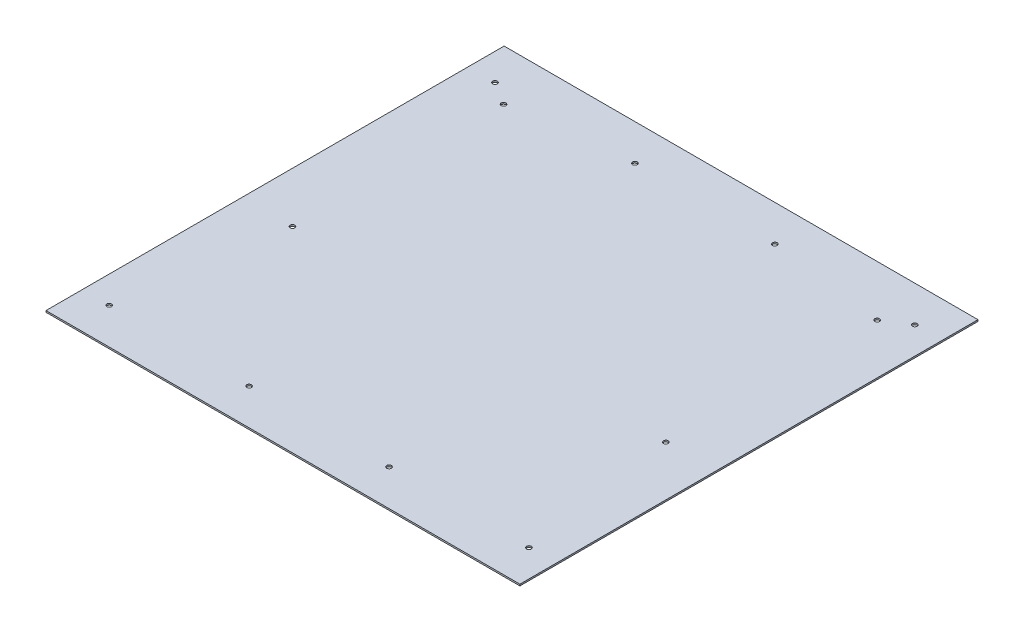
ISO-10303-21;
HEADER;
FILE_DESCRIPTION(('STEP AP214'),'2;1');
FILE_NAME('part.step','',(''),(''),'','','');
FILE_SCHEMA(('AUTOMOTIVE_DESIGN { 1 0 10303 214 1 1 1 1 }'));
ENDSEC;
DATA;
#1=APPLICATION_CONTEXT('core data for automotive mechanical design processes');
#2=APPLICATION_PROTOCOL_DEFINITION('international standard','automotive_design',2000,#1);
#3=PRODUCT_CONTEXT('',#1,'mechanical');
#4=PRODUCT('Part','Part','',(#3));
#5=PRODUCT_RELATED_PRODUCT_CATEGORY('part','',(#4));
#6=PRODUCT_DEFINITION_FORMATION('','',#4);
#7=PRODUCT_DEFINITION_CONTEXT('part definition',#1,'design');
#8=PRODUCT_DEFINITION('design','',#6,#7);
#9=PRODUCT_DEFINITION_SHAPE('','',#8);
#10=(LENGTH_UNIT() NAMED_UNIT(*) SI_UNIT(.MILLI.,.METRE.));
#11=(NAMED_UNIT(*) PLANE_ANGLE_UNIT() SI_UNIT($,.RADIAN.));
#12=(NAMED_UNIT(*) SI_UNIT($,.STERADIAN.) SOLID_ANGLE_UNIT());
#13=UNCERTAINTY_MEASURE_WITH_UNIT(LENGTH_MEASURE(1.E-05),#10,'distance_accuracy_value','');
#14=(GEOMETRIC_REPRESENTATION_CONTEXT(3) GLOBAL_UNCERTAINTY_ASSIGNED_CONTEXT((#13)) GLOBAL_UNIT_ASSIGNED_CONTEXT((#10,
#11,#12)) REPRESENTATION_CONTEXT('',''));
#15=CARTESIAN_POINT('',(0.,0.,0.));
#16=DIRECTION('',(0.,0.,1.));
#17=DIRECTION('',(1.,0.,0.));
#18=AXIS2_PLACEMENT_3D('',#15,#16,#17);
#19=CARTESIAN_POINT('',(0.,-1.,0.));
#20=DIRECTION('',(-1.,0.,0.));
#21=DIRECTION('',(0.,0.,1.));
#22=AXIS2_PLACEMENT_3D('',#19,#20,#21);
#23=PLANE('',#22);
#24=DIRECTION('',(0.,0.,1.));
#25=VECTOR('',#24,1.);
#26=CARTESIAN_POINT('',(0.,0.,0.));
#27=LINE('',#26,#25);
#28=CARTESIAN_POINT('',(0.,0.,0.));
#29=VERTEX_POINT('',#28);
#30=CARTESIAN_POINT('',(0.,0.,290.));
#31=VERTEX_POINT('',#30);
#32=EDGE_CURVE('E108',#29,#31,#27,.T.);
#33=ORIENTED_EDGE('',*,*,#32,.F.);
#34=DIRECTION('',(0.,1.,0.));
#35=VECTOR('',#34,1.);
#36=CARTESIAN_POINT('',(0.,-1.,0.));
#37=LINE('',#36,#35);
#38=CARTESIAN_POINT('',(0.,-1.,0.));
#39=VERTEX_POINT('',#38);
#40=EDGE_CURVE('E11',#39,#29,#37,.T.);
#41=ORIENTED_EDGE('',*,*,#40,.F.);
#42=DIRECTION('',(0.,0.,1.));
#43=VECTOR('',#42,1.);
#44=CARTESIAN_POINT('',(0.,-1.,0.));
#45=LINE('',#44,#43);
#46=CARTESIAN_POINT('',(0.,-1.,290.));
#47=VERTEX_POINT('',#46);
#48=EDGE_CURVE('E101',#39,#47,#45,.T.);
#49=ORIENTED_EDGE('',*,*,#48,.T.);
#50=DIRECTION('',(0.,1.,0.));
#51=VECTOR('',#50,1.);
#52=CARTESIAN_POINT('',(0.,-1.,290.));
#53=LINE('',#52,#51);
#54=EDGE_CURVE('E46',#47,#31,#53,.T.);
#55=ORIENTED_EDGE('',*,*,#54,.T.);
#56=EDGE_LOOP('',(#33,#41,#49,#55));
#57=FACE_BOUND('',#56,.T.);
#58=ADVANCED_FACE('F43',(#57),#23,.T.);
#59=CARTESIAN_POINT('',(0.,-1.,0.));
#60=DIRECTION('',(0.,0.,-1.));
#61=DIRECTION('',(-1.,0.,0.));
#62=AXIS2_PLACEMENT_3D('',#59,#60,#61);
#63=PLANE('',#62);
#64=DIRECTION('',(-1.,0.,0.));
#65=VECTOR('',#64,1.);
#66=CARTESIAN_POINT('',(0.,0.,0.));
#67=LINE('',#66,#65);
#68=CARTESIAN_POINT('',(300.,0.,0.));
#69=VERTEX_POINT('',#68);
#70=EDGE_CURVE('E103',#69,#29,#67,.T.);
#71=ORIENTED_EDGE('',*,*,#70,.F.);
#72=DIRECTION('',(0.,1.,0.));
#73=VECTOR('',#72,1.);
#74=CARTESIAN_POINT('',(300.,-1.,0.));
#75=LINE('',#74,#73);
#76=CARTESIAN_POINT('',(300.,-1.,0.));
#77=VERTEX_POINT('',#76);
#78=EDGE_CURVE('E52',#77,#69,#75,.T.);
#79=ORIENTED_EDGE('',*,*,#78,.F.);
#80=DIRECTION('',(-1.,0.,0.));
#81=VECTOR('',#80,1.);
#82=CARTESIAN_POINT('',(0.,-1.,0.));
#83=LINE('',#82,#81);
#84=EDGE_CURVE('E98',#77,#39,#83,.T.);
#85=ORIENTED_EDGE('',*,*,#84,.T.);
#86=ORIENTED_EDGE('',*,*,#40,.T.);
#87=EDGE_LOOP('',(#71,#79,#85,#86));
#88=FACE_BOUND('',#87,.T.);
#89=ADVANCED_FACE('F119',(#88),#63,.T.);
#90=CARTESIAN_POINT('',(300.,-1.,0.));
#91=DIRECTION('',(1.,0.,0.));
#92=DIRECTION('',(0.,0.,-1.));
#93=AXIS2_PLACEMENT_3D('',#90,#91,#92);
#94=PLANE('',#93);
#95=DIRECTION('',(0.,0.,-1.));
#96=VECTOR('',#95,1.);
#97=CARTESIAN_POINT('',(300.,0.,0.));
#98=LINE('',#97,#96);
#99=CARTESIAN_POINT('',(300.,0.,290.));
#100=VERTEX_POINT('',#99);
#101=EDGE_CURVE('E93',#100,#69,#98,.T.);
#102=ORIENTED_EDGE('',*,*,#101,.F.);
#103=DIRECTION('',(0.,1.,0.));
#104=VECTOR('',#103,1.);
#105=CARTESIAN_POINT('',(300.,-1.,290.));
#106=LINE('',#105,#104);
#107=CARTESIAN_POINT('',(300.,-1.,290.));
#108=VERTEX_POINT('',#107);
#109=EDGE_CURVE('E88',#108,#100,#106,.T.);
#110=ORIENTED_EDGE('',*,*,#109,.F.);
#111=DIRECTION('',(0.,0.,-1.));
#112=VECTOR('',#111,1.);
#113=CARTESIAN_POINT('',(300.,-1.,0.));
#114=LINE('',#113,#112);
#115=EDGE_CURVE('E91',#108,#77,#114,.T.);
#116=ORIENTED_EDGE('',*,*,#115,.T.);
#117=ORIENTED_EDGE('',*,*,#78,.T.);
#118=EDGE_LOOP('',(#102,#110,#116,#117));
#119=FACE_BOUND('',#118,.T.);
#120=ADVANCED_FACE('F90',(#119),#94,.T.);
#121=CARTESIAN_POINT('',(0.,-1.,290.));
#122=DIRECTION('',(0.,0.,1.));
#123=DIRECTION('',(1.,0.,0.));
#124=AXIS2_PLACEMENT_3D('',#121,#122,#123);
#125=PLANE('',#124);
#126=DIRECTION('',(1.,0.,0.));
#127=VECTOR('',#126,1.);
#128=CARTESIAN_POINT('',(0.,0.,290.));
#129=LINE('',#128,#127);
#130=EDGE_CURVE('E111',#31,#100,#129,.T.);
#131=ORIENTED_EDGE('',*,*,#130,.F.);
#132=ORIENTED_EDGE('',*,*,#54,.F.);
#133=DIRECTION('',(1.,0.,0.));
#134=VECTOR('',#133,1.);
#135=CARTESIAN_POINT('',(0.,-1.,290.));
#136=LINE('',#135,#134);
#137=EDGE_CURVE('E97',#47,#108,#136,.T.);
#138=ORIENTED_EDGE('',*,*,#137,.T.);
#139=ORIENTED_EDGE('',*,*,#109,.T.);
#140=EDGE_LOOP('',(#131,#132,#138,#139));
#141=FACE_BOUND('',#140,.T.);
#142=ADVANCED_FACE('F100',(#141),#125,.T.);
#143=CARTESIAN_POINT('',(0.,-1.,0.));
#144=DIRECTION('',(0.,1.,0.));
#145=DIRECTION('',(0.,0.,1.));
#146=AXIS2_PLACEMENT_3D('',#143,#144,#145);
#147=PLANE('',#146);
#148=CARTESIAN_POINT('',(268.313000000019,-1.,32.1322486581503));
#149=DIRECTION('',(0.,1.,0.));
#150=DIRECTION('',(0.,0.,1.));
#151=AXIS2_PLACEMENT_3D('',#148,#149,#150);
#152=CIRCLE('',#151,1.49999999999997);
#153=CARTESIAN_POINT('',(268.313000000019,-1.,33.6322486581503));
#154=VERTEX_POINT('',#153);
#155=EDGE_CURVE('E214',#154,#154,#152,.T.);
#156=ORIENTED_EDGE('',*,*,#155,.T.);
#157=EDGE_LOOP('',(#156));
#158=FACE_BOUND('',#157,.T.);
#159=CARTESIAN_POINT('',(268.313000000019,-1.,165.93924865815));
#160=DIRECTION('',(0.,1.,0.));
#161=DIRECTION('',(0.,0.,1.));
#162=AXIS2_PLACEMENT_3D('',#159,#160,#161);
#163=CIRCLE('',#162,1.49999999999996);
#164=CARTESIAN_POINT('',(268.313000000019,-1.,167.43924865815));
#165=VERTEX_POINT('',#164);
#166=EDGE_CURVE('E208',#165,#165,#163,.T.);
#167=ORIENTED_EDGE('',*,*,#166,.T.);
#168=EDGE_LOOP('',(#167));
#169=FACE_BOUND('',#168,.T.);
#170=CARTESIAN_POINT('',(31.9410000000192,-1.,165.93924865815));
#171=DIRECTION('',(0.,1.,0.));
#172=DIRECTION('',(0.,0.,1.));
#173=AXIS2_PLACEMENT_3D('',#170,#171,#172);
#174=CIRCLE('',#173,1.5);
#175=CARTESIAN_POINT('',(31.9410000000192,-1.,167.43924865815));
#176=VERTEX_POINT('',#175);
#177=EDGE_CURVE('E193',#176,#176,#174,.T.);
#178=ORIENTED_EDGE('',*,*,#177,.T.);
#179=EDGE_LOOP('',(#178));
#180=FACE_BOUND('',#179,.T.);
#181=CARTESIAN_POINT('',(31.7630000000192,-1.,32.1322486581503));
#182=DIRECTION('',(0.,1.,0.));
#183=DIRECTION('',(0.,0.,1.));
#184=AXIS2_PLACEMENT_3D('',#181,#182,#183);
#185=CIRCLE('',#184,1.5);
#186=CARTESIAN_POINT('',(31.7630000000192,-1.,33.6322486581503));
#187=VERTEX_POINT('',#186);
#188=EDGE_CURVE('E201',#187,#187,#185,.T.);
#189=ORIENTED_EDGE('',*,*,#188,.T.);
#190=EDGE_LOOP('',(#189));
#191=FACE_BOUND('',#190,.T.);
#192=CARTESIAN_POINT('',(105.710566666667,-1.,267.131700000001));
#193=DIRECTION('',(0.,-1.,0.));
#194=DIRECTION('',(0.,0.,-1.));
#195=AXIS2_PLACEMENT_3D('',#192,#193,#194);
#196=CIRCLE('',#195,1.49999999999994);
#197=CARTESIAN_POINT('',(105.710566666667,-1.,265.631700000001));
#198=VERTEX_POINT('',#197);
#199=EDGE_CURVE('E240',#198,#198,#196,.T.);
#200=ORIENTED_EDGE('',*,*,#199,.F.);
#201=EDGE_LOOP('',(#200));
#202=FACE_BOUND('',#201,.T.);
#203=CARTESIAN_POINT('',(194.289433333333,-1.,267.131700000001));
#204=DIRECTION('',(0.,-1.,0.));
#205=DIRECTION('',(0.,0.,-1.));
#206=AXIS2_PLACEMENT_3D('',#203,#204,#205);
#207=CIRCLE('',#206,1.49999999999994);
#208=CARTESIAN_POINT('',(194.289433333333,-1.,265.631700000001));
#209=VERTEX_POINT('',#208);
#210=EDGE_CURVE('E241',#209,#209,#207,.T.);
#211=ORIENTED_EDGE('',*,*,#210,.F.);
#212=EDGE_LOOP('',(#211));
#213=FACE_BOUND('',#212,.T.);
#214=CARTESIAN_POINT('',(282.8683,-1.,267.131700000001));
#215=DIRECTION('',(0.,-1.,0.));
#216=DIRECTION('',(0.,0.,-1.));
#217=AXIS2_PLACEMENT_3D('',#214,#215,#216);
#218=CIRCLE('',#217,1.49999999999992);
#219=CARTESIAN_POINT('',(282.8683,-1.,265.631700000001));
#220=VERTEX_POINT('',#219);
#221=EDGE_CURVE('E248',#220,#220,#218,.T.);
#222=ORIENTED_EDGE('',*,*,#221,.F.);
#223=EDGE_LOOP('',(#222));
#224=FACE_BOUND('',#223,.T.);
#225=CARTESIAN_POINT('',(282.8683,-1.,22.8682999999996));
#226=DIRECTION('',(0.,-1.,0.));
#227=DIRECTION('',(0.,0.,-1.));
#228=AXIS2_PLACEMENT_3D('',#225,#226,#227);
#229=CIRCLE('',#228,1.50000000000002);
#230=CARTESIAN_POINT('',(282.8683,-1.,21.3682999999996));
#231=VERTEX_POINT('',#230);
#232=EDGE_CURVE('E254',#231,#231,#229,.T.);
#233=ORIENTED_EDGE('',*,*,#232,.F.);
#234=EDGE_LOOP('',(#233));
#235=FACE_BOUND('',#234,.T.);
#236=CARTESIAN_POINT('',(194.289433333333,-1.,22.8682999999996));
#237=DIRECTION('',(0.,-1.,0.));
#238=DIRECTION('',(0.,0.,-1.));
#239=AXIS2_PLACEMENT_3D('',#236,#237,#238);
#240=CIRCLE('',#239,1.5);
#241=CARTESIAN_POINT('',(194.289433333333,-1.,21.3682999999996));
#242=VERTEX_POINT('',#241);
#243=EDGE_CURVE('E222',#242,#242,#240,.T.);
#244=ORIENTED_EDGE('',*,*,#243,.F.);
#245=EDGE_LOOP('',(#244));
#246=FACE_BOUND('',#245,.T.);
#247=CARTESIAN_POINT('',(105.710566666667,-1.,22.8682999999996));
#248=DIRECTION('',(0.,-1.,0.));
#249=DIRECTION('',(0.,0.,-1.));
#250=AXIS2_PLACEMENT_3D('',#247,#248,#249);
#251=CIRCLE('',#250,1.5);
#252=CARTESIAN_POINT('',(105.710566666667,-1.,21.3682999999996));
#253=VERTEX_POINT('',#252);
#254=EDGE_CURVE('E223',#253,#253,#251,.T.);
#255=ORIENTED_EDGE('',*,*,#254,.F.);
#256=EDGE_LOOP('',(#255));
#257=FACE_BOUND('',#256,.T.);
#258=CARTESIAN_POINT('',(17.1316999999999,-1.,22.8683));
#259=DIRECTION('',(0.,-1.,0.));
#260=DIRECTION('',(0.,0.,-1.));
#261=AXIS2_PLACEMENT_3D('',#258,#259,#260);
#262=CIRCLE('',#261,1.49999999999999);
#263=CARTESIAN_POINT('',(17.1316999999999,-1.,21.3683));
#264=VERTEX_POINT('',#263);
#265=EDGE_CURVE('E230',#264,#264,#262,.T.);
#266=ORIENTED_EDGE('',*,*,#265,.F.);
#267=EDGE_LOOP('',(#266));
#268=FACE_BOUND('',#267,.T.);
#269=CARTESIAN_POINT('',(17.1316999999999,-1.,267.131700000001));
#270=DIRECTION('',(0.,-1.,0.));
#271=DIRECTION('',(0.,0.,-1.));
#272=AXIS2_PLACEMENT_3D('',#269,#270,#271);
#273=CIRCLE('',#272,1.49999999999994);
#274=CARTESIAN_POINT('',(17.1316999999999,-1.,265.631700000001));
#275=VERTEX_POINT('',#274);
#276=EDGE_CURVE('E244',#275,#275,#273,.T.);
#277=ORIENTED_EDGE('',*,*,#276,.F.);
#278=EDGE_LOOP('',(#277));
#279=FACE_BOUND('',#278,.T.);
#280=ORIENTED_EDGE('',*,*,#48,.F.);
#281=ORIENTED_EDGE('',*,*,#84,.F.);
#282=ORIENTED_EDGE('',*,*,#115,.F.);
#283=ORIENTED_EDGE('',*,*,#137,.F.);
#284=EDGE_LOOP('',(#280,#281,#282,#283));
#285=FACE_BOUND('',#284,.T.);
#286=ADVANCED_FACE('F96',(#158,#169,#180,#191,#202,#213,#224,#235,#246,#257,#268,#279,#285),
#147,.F.);
#287=CARTESIAN_POINT('',(0.,0.,0.));
#288=DIRECTION('',(0.,1.,0.));
#289=DIRECTION('',(0.,0.,1.));
#290=AXIS2_PLACEMENT_3D('',#287,#288,#289);
#291=PLANE('',#290);
#292=CARTESIAN_POINT('',(268.313000000019,0.,32.1322486581503));
#293=DIRECTION('',(0.,1.,0.));
#294=DIRECTION('',(0.,0.,1.));
#295=AXIS2_PLACEMENT_3D('',#292,#293,#294);
#296=CIRCLE('',#295,1.49999999999997);
#297=CARTESIAN_POINT('',(268.313000000019,0.,33.6322486581503));
#298=VERTEX_POINT('',#297);
#299=EDGE_CURVE('E211',#298,#298,#296,.T.);
#300=ORIENTED_EDGE('',*,*,#299,.F.);
#301=EDGE_LOOP('',(#300));
#302=FACE_BOUND('',#301,.T.);
#303=CARTESIAN_POINT('',(268.313000000019,0.,165.93924865815));
#304=DIRECTION('',(0.,1.,0.));
#305=DIRECTION('',(0.,0.,1.));
#306=AXIS2_PLACEMENT_3D('',#303,#304,#305);
#307=CIRCLE('',#306,1.49999999999996);
#308=CARTESIAN_POINT('',(268.313000000019,0.,167.43924865815));
#309=VERTEX_POINT('',#308);
#310=EDGE_CURVE('E203',#309,#309,#307,.T.);
#311=ORIENTED_EDGE('',*,*,#310,.F.);
#312=EDGE_LOOP('',(#311));
#313=FACE_BOUND('',#312,.T.);
#314=CARTESIAN_POINT('',(31.9410000000192,0.,165.93924865815));
#315=DIRECTION('',(0.,1.,0.));
#316=DIRECTION('',(0.,0.,1.));
#317=AXIS2_PLACEMENT_3D('',#314,#315,#316);
#318=CIRCLE('',#317,1.5);
#319=CARTESIAN_POINT('',(31.9410000000192,0.,167.43924865815));
#320=VERTEX_POINT('',#319);
#321=EDGE_CURVE('E196',#320,#320,#318,.T.);
#322=ORIENTED_EDGE('',*,*,#321,.F.);
#323=EDGE_LOOP('',(#322));
#324=FACE_BOUND('',#323,.T.);
#325=CARTESIAN_POINT('',(31.7630000000192,0.,32.1322486581503));
#326=DIRECTION('',(0.,1.,0.));
#327=DIRECTION('',(0.,0.,1.));
#328=AXIS2_PLACEMENT_3D('',#325,#326,#327);
#329=CIRCLE('',#328,1.5);
#330=CARTESIAN_POINT('',(31.7630000000192,0.,33.6322486581503));
#331=VERTEX_POINT('',#330);
#332=EDGE_CURVE('E198',#331,#331,#329,.T.);
#333=ORIENTED_EDGE('',*,*,#332,.F.);
#334=EDGE_LOOP('',(#333));
#335=FACE_BOUND('',#334,.T.);
#336=CARTESIAN_POINT('',(105.710566666667,0.,267.131700000001));
#337=DIRECTION('',(0.,1.,0.));
#338=DIRECTION('',(0.,0.,1.));
#339=AXIS2_PLACEMENT_3D('',#336,#337,#338);
#340=CIRCLE('',#339,1.49999999999994);
#341=CARTESIAN_POINT('',(105.710566666667,0.,268.6317));
#342=VERTEX_POINT('',#341);
#343=EDGE_CURVE('E237',#342,#342,#340,.F.);
#344=ORIENTED_EDGE('',*,*,#343,.T.);
#345=EDGE_LOOP('',(#344));
#346=FACE_BOUND('',#345,.T.);
#347=CARTESIAN_POINT('',(194.289433333333,0.,267.131700000001));
#348=DIRECTION('',(0.,1.,0.));
#349=DIRECTION('',(0.,0.,1.));
#350=AXIS2_PLACEMENT_3D('',#347,#348,#349);
#351=CIRCLE('',#350,1.49999999999994);
#352=CARTESIAN_POINT('',(194.289433333333,0.,268.6317));
#353=VERTEX_POINT('',#352);
#354=EDGE_CURVE('E245',#353,#353,#351,.F.);
#355=ORIENTED_EDGE('',*,*,#354,.T.);
#356=EDGE_LOOP('',(#355));
#357=FACE_BOUND('',#356,.T.);
#358=CARTESIAN_POINT('',(282.8683,0.,267.131700000001));
#359=DIRECTION('',(0.,1.,0.));
#360=DIRECTION('',(0.,0.,1.));
#361=AXIS2_PLACEMENT_3D('',#358,#359,#360);
#362=CIRCLE('',#361,1.49999999999992);
#363=CARTESIAN_POINT('',(282.8683,0.,268.6317));
#364=VERTEX_POINT('',#363);
#365=EDGE_CURVE('E251',#364,#364,#362,.F.);
#366=ORIENTED_EDGE('',*,*,#365,.T.);
#367=EDGE_LOOP('',(#366));
#368=FACE_BOUND('',#367,.T.);
#369=CARTESIAN_POINT('',(282.8683,0.,22.8682999999996));
#370=DIRECTION('',(0.,1.,0.));
#371=DIRECTION('',(0.,0.,1.));
#372=AXIS2_PLACEMENT_3D('',#369,#370,#371);
#373=CIRCLE('',#372,1.50000000000002);
#374=CARTESIAN_POINT('',(282.8683,0.,24.3682999999996));
#375=VERTEX_POINT('',#374);
#376=EDGE_CURVE('E226',#375,#375,#373,.F.);
#377=ORIENTED_EDGE('',*,*,#376,.T.);
#378=EDGE_LOOP('',(#377));
#379=FACE_BOUND('',#378,.T.);
#380=CARTESIAN_POINT('',(194.289433333333,0.,22.8682999999996));
#381=DIRECTION('',(0.,1.,0.));
#382=DIRECTION('',(0.,0.,1.));
#383=AXIS2_PLACEMENT_3D('',#380,#381,#382);
#384=CIRCLE('',#383,1.5);
#385=CARTESIAN_POINT('',(194.289433333333,0.,24.3682999999996));
#386=VERTEX_POINT('',#385);
#387=EDGE_CURVE('E219',#386,#386,#384,.F.);
#388=ORIENTED_EDGE('',*,*,#387,.T.);
#389=EDGE_LOOP('',(#388));
#390=FACE_BOUND('',#389,.T.);
#391=CARTESIAN_POINT('',(105.710566666667,0.,22.8682999999996));
#392=DIRECTION('',(0.,1.,0.));
#393=DIRECTION('',(0.,0.,1.));
#394=AXIS2_PLACEMENT_3D('',#391,#392,#393);
#395=CIRCLE('',#394,1.5);
#396=CARTESIAN_POINT('',(105.710566666667,0.,24.3682999999996));
#397=VERTEX_POINT('',#396);
#398=EDGE_CURVE('E227',#397,#397,#395,.F.);
#399=ORIENTED_EDGE('',*,*,#398,.T.);
#400=EDGE_LOOP('',(#399));
#401=FACE_BOUND('',#400,.T.);
#402=CARTESIAN_POINT('',(17.1316999999999,0.,22.8683));
#403=DIRECTION('',(0.,1.,0.));
#404=DIRECTION('',(0.,0.,1.));
#405=AXIS2_PLACEMENT_3D('',#402,#403,#404);
#406=CIRCLE('',#405,1.49999999999999);
#407=CARTESIAN_POINT('',(17.1316999999999,0.,24.3683));
#408=VERTEX_POINT('',#407);
#409=EDGE_CURVE('E217',#408,#408,#406,.F.);
#410=ORIENTED_EDGE('',*,*,#409,.T.);
#411=EDGE_LOOP('',(#410));
#412=FACE_BOUND('',#411,.T.);
#413=CARTESIAN_POINT('',(17.1316999999999,0.,267.131700000001));
#414=DIRECTION('',(0.,1.,0.));
#415=DIRECTION('',(0.,0.,1.));
#416=AXIS2_PLACEMENT_3D('',#413,#414,#415);
#417=CIRCLE('',#416,1.49999999999994);
#418=CARTESIAN_POINT('',(17.1316999999999,0.,268.6317));
#419=VERTEX_POINT('',#418);
#420=EDGE_CURVE('E112',#419,#419,#417,.F.);
#421=ORIENTED_EDGE('',*,*,#420,.T.);
#422=EDGE_LOOP('',(#421));
#423=FACE_BOUND('',#422,.T.);
#424=ORIENTED_EDGE('',*,*,#32,.T.);
#425=ORIENTED_EDGE('',*,*,#130,.T.);
#426=ORIENTED_EDGE('',*,*,#101,.T.);
#427=ORIENTED_EDGE('',*,*,#70,.T.);
#428=EDGE_LOOP('',(#424,#425,#426,#427));
#429=FACE_BOUND('',#428,.T.);
#430=ADVANCED_FACE('F118',(#302,#313,#324,#335,#346,#357,#368,#379,#390,#401,#412,#423,#429),
#291,.T.);
#431=CARTESIAN_POINT('',(17.1316999999999,4.24264068711932,267.131700000001));
#432=DIRECTION('',(0.,-1.,0.));
#433=DIRECTION('',(0.,0.,-1.));
#434=AXIS2_PLACEMENT_3D('',#431,#432,#433);
#435=CYLINDRICAL_SURFACE('',#434,1.49999999999994);
#436=ORIENTED_EDGE('',*,*,#276,.T.);
#437=EDGE_LOOP('',(#436));
#438=FACE_BOUND('',#437,.T.);
#439=ORIENTED_EDGE('',*,*,#420,.F.);
#440=EDGE_LOOP('',(#439));
#441=FACE_BOUND('',#440,.T.);
#442=ADVANCED_FACE('F137',(#438,#441),#435,.F.);
#443=CARTESIAN_POINT('',(17.1316999999999,4.24264068711932,22.8683));
#444=DIRECTION('',(0.,-1.,0.));
#445=DIRECTION('',(0.,0.,-1.));
#446=AXIS2_PLACEMENT_3D('',#443,#444,#445);
#447=CYLINDRICAL_SURFACE('',#446,1.49999999999999);
#448=ORIENTED_EDGE('',*,*,#265,.T.);
#449=EDGE_LOOP('',(#448));
#450=FACE_BOUND('',#449,.T.);
#451=ORIENTED_EDGE('',*,*,#409,.F.);
#452=EDGE_LOOP('',(#451));
#453=FACE_BOUND('',#452,.T.);
#454=ADVANCED_FACE('F144',(#450,#453),#447,.F.);
#455=CARTESIAN_POINT('',(105.710566666667,4.24264068711932,22.8682999999996));
#456=DIRECTION('',(0.,-1.,0.));
#457=DIRECTION('',(0.,0.,-1.));
#458=AXIS2_PLACEMENT_3D('',#455,#456,#457);
#459=CYLINDRICAL_SURFACE('',#458,1.5);
#460=ORIENTED_EDGE('',*,*,#254,.T.);
#461=EDGE_LOOP('',(#460));
#462=FACE_BOUND('',#461,.T.);
#463=ORIENTED_EDGE('',*,*,#398,.F.);
#464=EDGE_LOOP('',(#463));
#465=FACE_BOUND('',#464,.T.);
#466=ADVANCED_FACE('F166',(#462,#465),#459,.F.);
#467=CARTESIAN_POINT('',(194.289433333333,4.24264068711932,22.8682999999996));
#468=DIRECTION('',(0.,-1.,0.));
#469=DIRECTION('',(0.,0.,-1.));
#470=AXIS2_PLACEMENT_3D('',#467,#468,#469);
#471=CYLINDRICAL_SURFACE('',#470,1.5);
#472=ORIENTED_EDGE('',*,*,#243,.T.);
#473=EDGE_LOOP('',(#472));
#474=FACE_BOUND('',#473,.T.);
#475=ORIENTED_EDGE('',*,*,#387,.F.);
#476=EDGE_LOOP('',(#475));
#477=FACE_BOUND('',#476,.T.);
#478=ADVANCED_FACE('F150',(#474,#477),#471,.F.);
#479=CARTESIAN_POINT('',(282.8683,4.24264068711932,22.8682999999996));
#480=DIRECTION('',(0.,-1.,0.));
#481=DIRECTION('',(0.,0.,-1.));
#482=AXIS2_PLACEMENT_3D('',#479,#480,#481);
#483=CYLINDRICAL_SURFACE('',#482,1.50000000000002);
#484=ORIENTED_EDGE('',*,*,#232,.T.);
#485=EDGE_LOOP('',(#484));
#486=FACE_BOUND('',#485,.T.);
#487=ORIENTED_EDGE('',*,*,#376,.F.);
#488=EDGE_LOOP('',(#487));
#489=FACE_BOUND('',#488,.T.);
#490=ADVANCED_FACE('F146',(#486,#489),#483,.F.);
#491=CARTESIAN_POINT('',(282.8683,4.24264068711932,267.131700000001));
#492=DIRECTION('',(0.,-1.,0.));
#493=DIRECTION('',(0.,0.,-1.));
#494=AXIS2_PLACEMENT_3D('',#491,#492,#493);
#495=CYLINDRICAL_SURFACE('',#494,1.49999999999992);
#496=ORIENTED_EDGE('',*,*,#221,.T.);
#497=EDGE_LOOP('',(#496));
#498=FACE_BOUND('',#497,.T.);
#499=ORIENTED_EDGE('',*,*,#365,.F.);
#500=EDGE_LOOP('',(#499));
#501=FACE_BOUND('',#500,.T.);
#502=ADVANCED_FACE('F149',(#498,#501),#495,.F.);
#503=CARTESIAN_POINT('',(194.289433333333,4.24264068711932,267.131700000001));
#504=DIRECTION('',(0.,-1.,0.));
#505=DIRECTION('',(0.,0.,-1.));
#506=AXIS2_PLACEMENT_3D('',#503,#504,#505);
#507=CYLINDRICAL_SURFACE('',#506,1.49999999999994);
#508=ORIENTED_EDGE('',*,*,#210,.T.);
#509=EDGE_LOOP('',(#508));
#510=FACE_BOUND('',#509,.T.);
#511=ORIENTED_EDGE('',*,*,#354,.F.);
#512=EDGE_LOOP('',(#511));
#513=FACE_BOUND('',#512,.T.);
#514=ADVANCED_FACE('F154',(#510,#513),#507,.F.);
#515=CARTESIAN_POINT('',(105.710566666667,4.24264068711932,267.131700000001));
#516=DIRECTION('',(0.,-1.,0.));
#517=DIRECTION('',(0.,0.,-1.));
#518=AXIS2_PLACEMENT_3D('',#515,#516,#517);
#519=CYLINDRICAL_SURFACE('',#518,1.49999999999994);
#520=ORIENTED_EDGE('',*,*,#199,.T.);
#521=EDGE_LOOP('',(#520));
#522=FACE_BOUND('',#521,.T.);
#523=ORIENTED_EDGE('',*,*,#343,.F.);
#524=EDGE_LOOP('',(#523));
#525=FACE_BOUND('',#524,.T.);
#526=ADVANCED_FACE('F158',(#522,#525),#519,.F.);
#527=CARTESIAN_POINT('',(31.7630000000192,-1.,32.1322486581503));
#528=DIRECTION('',(0.,1.,0.));
#529=DIRECTION('',(0.,0.,1.));
#530=AXIS2_PLACEMENT_3D('',#527,#528,#529);
#531=CYLINDRICAL_SURFACE('',#530,1.5);
#532=ORIENTED_EDGE('',*,*,#188,.F.);
#533=EDGE_LOOP('',(#532));
#534=FACE_BOUND('',#533,.T.);
#535=ORIENTED_EDGE('',*,*,#332,.T.);
#536=EDGE_LOOP('',(#535));
#537=FACE_BOUND('',#536,.T.);
#538=ADVANCED_FACE('F162',(#534,#537),#531,.F.);
#539=CARTESIAN_POINT('',(31.9410000000192,-1.,165.93924865815));
#540=DIRECTION('',(0.,1.,0.));
#541=DIRECTION('',(0.,0.,1.));
#542=AXIS2_PLACEMENT_3D('',#539,#540,#541);
#543=CYLINDRICAL_SURFACE('',#542,1.5);
#544=ORIENTED_EDGE('',*,*,#177,.F.);
#545=EDGE_LOOP('',(#544));
#546=FACE_BOUND('',#545,.T.);
#547=ORIENTED_EDGE('',*,*,#321,.T.);
#548=EDGE_LOOP('',(#547));
#549=FACE_BOUND('',#548,.T.);
#550=ADVANCED_FACE('F176',(#546,#549),#543,.F.);
#551=CARTESIAN_POINT('',(268.313000000019,-1.,165.93924865815));
#552=DIRECTION('',(0.,1.,0.));
#553=DIRECTION('',(0.,0.,1.));
#554=AXIS2_PLACEMENT_3D('',#551,#552,#553);
#555=CYLINDRICAL_SURFACE('',#554,1.49999999999996);
#556=ORIENTED_EDGE('',*,*,#166,.F.);
#557=EDGE_LOOP('',(#556));
#558=FACE_BOUND('',#557,.T.);
#559=ORIENTED_EDGE('',*,*,#310,.T.);
#560=EDGE_LOOP('',(#559));
#561=FACE_BOUND('',#560,.T.);
#562=ADVANCED_FACE('F181',(#558,#561),#555,.F.);
#563=CARTESIAN_POINT('',(268.313000000019,-1.,32.1322486581503));
#564=DIRECTION('',(0.,1.,0.));
#565=DIRECTION('',(0.,0.,1.));
#566=AXIS2_PLACEMENT_3D('',#563,#564,#565);
#567=CYLINDRICAL_SURFACE('',#566,1.49999999999997);
#568=ORIENTED_EDGE('',*,*,#155,.F.);
#569=EDGE_LOOP('',(#568));
#570=FACE_BOUND('',#569,.T.);
#571=ORIENTED_EDGE('',*,*,#299,.T.);
#572=EDGE_LOOP('',(#571));
#573=FACE_BOUND('',#572,.T.);
#574=ADVANCED_FACE('F178',(#570,#573),#567,.F.);
#575=CLOSED_SHELL('',(#58,#89,#120,#142,#286,#430,#442,#454,#466,#478,#490,#502,#514,#526,#538,
#550,#562,#574));
#576=MANIFOLD_SOLID_BREP('B2',#575);
#577=ADVANCED_BREP_SHAPE_REPRESENTATION('',(#18,#576),#14);
#578=SHAPE_DEFINITION_REPRESENTATION(#9,#577);
ENDSEC;
END-ISO-10303-21;
